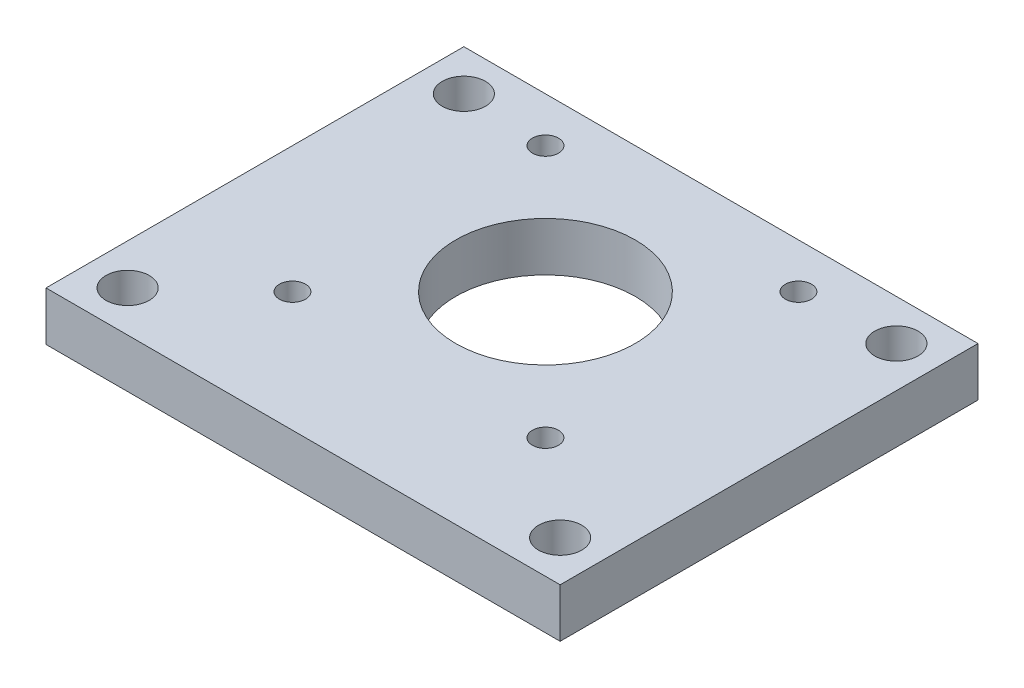
ISO-10303-21;
HEADER;
FILE_DESCRIPTION(('STEP AP214'),'2;1');
FILE_NAME('part.step','',(''),(''),'','','');
FILE_SCHEMA(('AUTOMOTIVE_DESIGN { 1 0 10303 214 1 1 1 1 }'));
ENDSEC;
DATA;
#1=APPLICATION_CONTEXT('core data for automotive mechanical design processes');
#2=APPLICATION_PROTOCOL_DEFINITION('international standard','automotive_design',2000,#1);
#3=PRODUCT_CONTEXT('',#1,'mechanical');
#4=PRODUCT('Part','Part','',(#3));
#5=PRODUCT_RELATED_PRODUCT_CATEGORY('part','',(#4));
#6=PRODUCT_DEFINITION_FORMATION('','',#4);
#7=PRODUCT_DEFINITION_CONTEXT('part definition',#1,'design');
#8=PRODUCT_DEFINITION('design','',#6,#7);
#9=PRODUCT_DEFINITION_SHAPE('','',#8);
#10=(LENGTH_UNIT() NAMED_UNIT(*) SI_UNIT(.MILLI.,.METRE.));
#11=(NAMED_UNIT(*) PLANE_ANGLE_UNIT() SI_UNIT($,.RADIAN.));
#12=(NAMED_UNIT(*) SI_UNIT($,.STERADIAN.) SOLID_ANGLE_UNIT());
#13=UNCERTAINTY_MEASURE_WITH_UNIT(LENGTH_MEASURE(1.E-05),#10,'distance_accuracy_value','');
#14=(GEOMETRIC_REPRESENTATION_CONTEXT(3) GLOBAL_UNCERTAINTY_ASSIGNED_CONTEXT((#13)) GLOBAL_UNIT_ASSIGNED_CONTEXT((#10,
#11,#12)) REPRESENTATION_CONTEXT('',''));
#15=CARTESIAN_POINT('',(0.,0.,0.));
#16=DIRECTION('',(0.,0.,1.));
#17=DIRECTION('',(1.,0.,0.));
#18=AXIS2_PLACEMENT_3D('',#15,#16,#17);
#19=CARTESIAN_POINT('',(0.,0.,0.));
#20=DIRECTION('',(0.,-1.,0.));
#21=DIRECTION('',(0.,0.,-1.));
#22=AXIS2_PLACEMENT_3D('',#19,#20,#21);
#23=PLANE('',#22);
#24=CARTESIAN_POINT('',(0.,0.,0.));
#25=DIRECTION('',(0.,1.,0.));
#26=DIRECTION('',(0.,0.,1.));
#27=AXIS2_PLACEMENT_3D('',#24,#25,#26);
#28=CIRCLE('',#27,11.);
#29=CARTESIAN_POINT('',(0.,0.,11.));
#30=VERTEX_POINT('',#29);
#31=EDGE_CURVE('E192',#30,#30,#28,.T.);
#32=ORIENTED_EDGE('',*,*,#31,.T.);
#33=EDGE_LOOP('',(#32));
#34=FACE_BOUND('',#33,.T.);
#35=CARTESIAN_POINT('',(-15.5,0.,-15.5));
#36=DIRECTION('',(0.,1.,0.));
#37=DIRECTION('',(0.,0.,1.));
#38=AXIS2_PLACEMENT_3D('',#35,#36,#37);
#39=CIRCLE('',#38,1.6);
#40=CARTESIAN_POINT('',(-15.5,0.,-13.9));
#41=VERTEX_POINT('',#40);
#42=EDGE_CURVE('E184',#41,#41,#39,.T.);
#43=ORIENTED_EDGE('',*,*,#42,.T.);
#44=EDGE_LOOP('',(#43));
#45=FACE_BOUND('',#44,.T.);
#46=DIRECTION('',(0.,0.,-1.));
#47=VECTOR('',#46,1.);
#48=CARTESIAN_POINT('',(32.,0.,-21.));
#49=LINE('',#48,#47);
#50=CARTESIAN_POINT('',(32.,0.,30.2));
#51=VERTEX_POINT('',#50);
#52=CARTESIAN_POINT('',(32.,0.,-21.));
#53=VERTEX_POINT('',#52);
#54=EDGE_CURVE('E108',#51,#53,#49,.T.);
#55=ORIENTED_EDGE('',*,*,#54,.F.);
#56=DIRECTION('',(1.,0.,0.));
#57=VECTOR('',#56,1.);
#58=CARTESIAN_POINT('',(32.,0.,30.2));
#59=LINE('',#58,#57);
#60=CARTESIAN_POINT('',(-31.,0.,30.2));
#61=VERTEX_POINT('',#60);
#62=EDGE_CURVE('E80',#61,#51,#59,.T.);
#63=ORIENTED_EDGE('',*,*,#62,.F.);
#64=DIRECTION('',(0.,0.,1.));
#65=VECTOR('',#64,1.);
#66=CARTESIAN_POINT('',(-31.,0.,30.2));
#67=LINE('',#66,#65);
#68=CARTESIAN_POINT('',(-31.,0.,-21.));
#69=VERTEX_POINT('',#68);
#70=EDGE_CURVE('E74',#69,#61,#67,.T.);
#71=ORIENTED_EDGE('',*,*,#70,.F.);
#72=DIRECTION('',(-1.,0.,0.));
#73=VECTOR('',#72,1.);
#74=CARTESIAN_POINT('',(-31.,0.,-21.));
#75=LINE('',#74,#73);
#76=EDGE_CURVE('E97',#53,#69,#75,.T.);
#77=ORIENTED_EDGE('',*,*,#76,.F.);
#78=EDGE_LOOP('',(#55,#63,#71,#77));
#79=FACE_BOUND('',#78,.T.);
#80=CARTESIAN_POINT('',(27.,0.,-16.));
#81=DIRECTION('',(0.,1.,0.));
#82=DIRECTION('',(0.,0.,1.));
#83=AXIS2_PLACEMENT_3D('',#80,#81,#82);
#84=CIRCLE('',#83,2.65);
#85=CARTESIAN_POINT('',(27.,0.,-13.35));
#86=VERTEX_POINT('',#85);
#87=EDGE_CURVE('E112',#86,#86,#84,.T.);
#88=ORIENTED_EDGE('',*,*,#87,.T.);
#89=EDGE_LOOP('',(#88));
#90=FACE_BOUND('',#89,.T.);
#91=CARTESIAN_POINT('',(27.,0.,25.2));
#92=DIRECTION('',(0.,1.,0.));
#93=DIRECTION('',(0.,0.,1.));
#94=AXIS2_PLACEMENT_3D('',#91,#92,#93);
#95=CIRCLE('',#94,2.65);
#96=CARTESIAN_POINT('',(27.,0.,27.85));
#97=VERTEX_POINT('',#96);
#98=EDGE_CURVE('E136',#97,#97,#95,.T.);
#99=ORIENTED_EDGE('',*,*,#98,.T.);
#100=EDGE_LOOP('',(#99));
#101=FACE_BOUND('',#100,.T.);
#102=CARTESIAN_POINT('',(-26.,0.,25.2));
#103=DIRECTION('',(0.,1.,0.));
#104=DIRECTION('',(0.,0.,1.));
#105=AXIS2_PLACEMENT_3D('',#102,#103,#104);
#106=CIRCLE('',#105,2.65);
#107=CARTESIAN_POINT('',(-26.,0.,27.85));
#108=VERTEX_POINT('',#107);
#109=EDGE_CURVE('E144',#108,#108,#106,.T.);
#110=ORIENTED_EDGE('',*,*,#109,.T.);
#111=EDGE_LOOP('',(#110));
#112=FACE_BOUND('',#111,.T.);
#113=CARTESIAN_POINT('',(-26.,0.,-16.));
#114=DIRECTION('',(0.,1.,0.));
#115=DIRECTION('',(0.,0.,1.));
#116=AXIS2_PLACEMENT_3D('',#113,#114,#115);
#117=CIRCLE('',#116,2.65);
#118=CARTESIAN_POINT('',(-26.,0.,-13.35));
#119=VERTEX_POINT('',#118);
#120=EDGE_CURVE('E152',#119,#119,#117,.T.);
#121=ORIENTED_EDGE('',*,*,#120,.T.);
#122=EDGE_LOOP('',(#121));
#123=FACE_BOUND('',#122,.T.);
#124=CARTESIAN_POINT('',(-15.5,0.,15.5));
#125=DIRECTION('',(0.,1.,0.));
#126=DIRECTION('',(0.,0.,1.));
#127=AXIS2_PLACEMENT_3D('',#124,#125,#126);
#128=CIRCLE('',#127,1.6);
#129=CARTESIAN_POINT('',(-15.5,0.,17.1));
#130=VERTEX_POINT('',#129);
#131=EDGE_CURVE('E160',#130,#130,#128,.T.);
#132=ORIENTED_EDGE('',*,*,#131,.T.);
#133=EDGE_LOOP('',(#132));
#134=FACE_BOUND('',#133,.T.);
#135=CARTESIAN_POINT('',(15.5,0.,15.5));
#136=DIRECTION('',(0.,1.,0.));
#137=DIRECTION('',(0.,0.,1.));
#138=AXIS2_PLACEMENT_3D('',#135,#136,#137);
#139=CIRCLE('',#138,1.6);
#140=CARTESIAN_POINT('',(15.5,0.,17.1));
#141=VERTEX_POINT('',#140);
#142=EDGE_CURVE('E168',#141,#141,#139,.T.);
#143=ORIENTED_EDGE('',*,*,#142,.T.);
#144=EDGE_LOOP('',(#143));
#145=FACE_BOUND('',#144,.T.);
#146=CARTESIAN_POINT('',(15.5,0.,-15.5));
#147=DIRECTION('',(0.,1.,0.));
#148=DIRECTION('',(0.,0.,1.));
#149=AXIS2_PLACEMENT_3D('',#146,#147,#148);
#150=CIRCLE('',#149,1.6);
#151=CARTESIAN_POINT('',(15.5,0.,-13.9));
#152=VERTEX_POINT('',#151);
#153=EDGE_CURVE('E176',#152,#152,#150,.T.);
#154=ORIENTED_EDGE('',*,*,#153,.T.);
#155=EDGE_LOOP('',(#154));
#156=FACE_BOUND('',#155,.T.);
#157=ADVANCED_FACE('F39',(#34,#45,#79,#90,#101,#112,#123,#134,#145,#156),#23,.T.);
#158=CARTESIAN_POINT('',(32.,6.,-21.));
#159=DIRECTION('',(-1.,0.,0.));
#160=DIRECTION('',(0.,0.,1.));
#161=AXIS2_PLACEMENT_3D('',#158,#159,#160);
#162=PLANE('',#161);
#163=ORIENTED_EDGE('',*,*,#54,.T.);
#164=DIRECTION('',(0.,-1.,0.));
#165=VECTOR('',#164,1.);
#166=CARTESIAN_POINT('',(32.,6.,-21.));
#167=LINE('',#166,#165);
#168=CARTESIAN_POINT('',(32.,6.,-21.));
#169=VERTEX_POINT('',#168);
#170=EDGE_CURVE('E11',#169,#53,#167,.T.);
#171=ORIENTED_EDGE('',*,*,#170,.F.);
#172=DIRECTION('',(0.,0.,-1.));
#173=VECTOR('',#172,1.);
#174=CARTESIAN_POINT('',(32.,6.,-21.));
#175=LINE('',#174,#173);
#176=CARTESIAN_POINT('',(32.,6.,30.2));
#177=VERTEX_POINT('',#176);
#178=EDGE_CURVE('E92',#177,#169,#175,.T.);
#179=ORIENTED_EDGE('',*,*,#178,.F.);
#180=DIRECTION('',(0.,-1.,0.));
#181=VECTOR('',#180,1.);
#182=CARTESIAN_POINT('',(32.,6.,30.2));
#183=LINE('',#182,#181);
#184=EDGE_CURVE('E104',#177,#51,#183,.T.);
#185=ORIENTED_EDGE('',*,*,#184,.T.);
#186=EDGE_LOOP('',(#163,#171,#179,#185));
#187=FACE_BOUND('',#186,.T.);
#188=ADVANCED_FACE('F41',(#187),#162,.F.);
#189=CARTESIAN_POINT('',(-31.,6.,-21.));
#190=DIRECTION('',(0.,0.,1.));
#191=DIRECTION('',(1.,0.,0.));
#192=AXIS2_PLACEMENT_3D('',#189,#190,#191);
#193=PLANE('',#192);
#194=ORIENTED_EDGE('',*,*,#76,.T.);
#195=DIRECTION('',(0.,-1.,0.));
#196=VECTOR('',#195,1.);
#197=CARTESIAN_POINT('',(-31.,6.,-21.));
#198=LINE('',#197,#196);
#199=CARTESIAN_POINT('',(-31.,6.,-21.));
#200=VERTEX_POINT('',#199);
#201=EDGE_CURVE('E49',#200,#69,#198,.T.);
#202=ORIENTED_EDGE('',*,*,#201,.F.);
#203=DIRECTION('',(-1.,0.,0.));
#204=VECTOR('',#203,1.);
#205=CARTESIAN_POINT('',(-31.,6.,-21.));
#206=LINE('',#205,#204);
#207=EDGE_CURVE('E87',#169,#200,#206,.T.);
#208=ORIENTED_EDGE('',*,*,#207,.F.);
#209=ORIENTED_EDGE('',*,*,#170,.T.);
#210=EDGE_LOOP('',(#194,#202,#208,#209));
#211=FACE_BOUND('',#210,.T.);
#212=ADVANCED_FACE('F96',(#211),#193,.F.);
#213=CARTESIAN_POINT('',(-31.,6.,30.2));
#214=DIRECTION('',(1.,0.,0.));
#215=DIRECTION('',(0.,0.,-1.));
#216=AXIS2_PLACEMENT_3D('',#213,#214,#215);
#217=PLANE('',#216);
#218=ORIENTED_EDGE('',*,*,#70,.T.);
#219=DIRECTION('',(0.,-1.,0.));
#220=VECTOR('',#219,1.);
#221=CARTESIAN_POINT('',(-31.,6.,30.2));
#222=LINE('',#221,#220);
#223=CARTESIAN_POINT('',(-31.,6.,30.2));
#224=VERTEX_POINT('',#223);
#225=EDGE_CURVE('E99',#224,#61,#222,.T.);
#226=ORIENTED_EDGE('',*,*,#225,.F.);
#227=DIRECTION('',(0.,0.,1.));
#228=VECTOR('',#227,1.);
#229=CARTESIAN_POINT('',(-31.,6.,30.2));
#230=LINE('',#229,#228);
#231=EDGE_CURVE('E90',#200,#224,#230,.T.);
#232=ORIENTED_EDGE('',*,*,#231,.F.);
#233=ORIENTED_EDGE('',*,*,#201,.T.);
#234=EDGE_LOOP('',(#218,#226,#232,#233));
#235=FACE_BOUND('',#234,.T.);
#236=ADVANCED_FACE('F100',(#235),#217,.F.);
#237=CARTESIAN_POINT('',(32.,6.,30.2));
#238=DIRECTION('',(0.,0.,-1.));
#239=DIRECTION('',(-1.,0.,0.));
#240=AXIS2_PLACEMENT_3D('',#237,#238,#239);
#241=PLANE('',#240);
#242=ORIENTED_EDGE('',*,*,#62,.T.);
#243=ORIENTED_EDGE('',*,*,#184,.F.);
#244=DIRECTION('',(1.,0.,0.));
#245=VECTOR('',#244,1.);
#246=CARTESIAN_POINT('',(32.,6.,30.2));
#247=LINE('',#246,#245);
#248=EDGE_CURVE('E57',#224,#177,#247,.T.);
#249=ORIENTED_EDGE('',*,*,#248,.F.);
#250=ORIENTED_EDGE('',*,*,#225,.T.);
#251=EDGE_LOOP('',(#242,#243,#249,#250));
#252=FACE_BOUND('',#251,.T.);
#253=ADVANCED_FACE('F122',(#252),#241,.F.);
#254=CARTESIAN_POINT('',(0.,6.,0.));
#255=DIRECTION('',(0.,-1.,0.));
#256=DIRECTION('',(0.,0.,-1.));
#257=AXIS2_PLACEMENT_3D('',#254,#255,#256);
#258=PLANE('',#257);
#259=CARTESIAN_POINT('',(0.,6.,0.));
#260=DIRECTION('',(0.,1.,0.));
#261=DIRECTION('',(0.,0.,1.));
#262=AXIS2_PLACEMENT_3D('',#259,#260,#261);
#263=CIRCLE('',#262,11.);
#264=CARTESIAN_POINT('',(0.,6.,11.));
#265=VERTEX_POINT('',#264);
#266=EDGE_CURVE('E196',#265,#265,#263,.T.);
#267=ORIENTED_EDGE('',*,*,#266,.F.);
#268=EDGE_LOOP('',(#267));
#269=FACE_BOUND('',#268,.T.);
#270=CARTESIAN_POINT('',(-15.5,6.,-15.5));
#271=DIRECTION('',(0.,1.,0.));
#272=DIRECTION('',(0.,0.,1.));
#273=AXIS2_PLACEMENT_3D('',#270,#271,#272);
#274=CIRCLE('',#273,1.6);
#275=CARTESIAN_POINT('',(-15.5,6.,-13.9));
#276=VERTEX_POINT('',#275);
#277=EDGE_CURVE('E188',#276,#276,#274,.T.);
#278=ORIENTED_EDGE('',*,*,#277,.F.);
#279=EDGE_LOOP('',(#278));
#280=FACE_BOUND('',#279,.T.);
#281=CARTESIAN_POINT('',(15.5,6.,-15.5));
#282=DIRECTION('',(0.,1.,0.));
#283=DIRECTION('',(0.,0.,1.));
#284=AXIS2_PLACEMENT_3D('',#281,#282,#283);
#285=CIRCLE('',#284,1.6);
#286=CARTESIAN_POINT('',(15.5,6.,-13.9));
#287=VERTEX_POINT('',#286);
#288=EDGE_CURVE('E180',#287,#287,#285,.T.);
#289=ORIENTED_EDGE('',*,*,#288,.F.);
#290=EDGE_LOOP('',(#289));
#291=FACE_BOUND('',#290,.T.);
#292=CARTESIAN_POINT('',(15.5,6.,15.5));
#293=DIRECTION('',(0.,1.,0.));
#294=DIRECTION('',(0.,0.,1.));
#295=AXIS2_PLACEMENT_3D('',#292,#293,#294);
#296=CIRCLE('',#295,1.6);
#297=CARTESIAN_POINT('',(15.5,6.,17.1));
#298=VERTEX_POINT('',#297);
#299=EDGE_CURVE('E172',#298,#298,#296,.T.);
#300=ORIENTED_EDGE('',*,*,#299,.F.);
#301=EDGE_LOOP('',(#300));
#302=FACE_BOUND('',#301,.T.);
#303=CARTESIAN_POINT('',(-15.5,6.,15.5));
#304=DIRECTION('',(0.,1.,0.));
#305=DIRECTION('',(0.,0.,1.));
#306=AXIS2_PLACEMENT_3D('',#303,#304,#305);
#307=CIRCLE('',#306,1.6);
#308=CARTESIAN_POINT('',(-15.5,6.,17.1));
#309=VERTEX_POINT('',#308);
#310=EDGE_CURVE('E164',#309,#309,#307,.T.);
#311=ORIENTED_EDGE('',*,*,#310,.F.);
#312=EDGE_LOOP('',(#311));
#313=FACE_BOUND('',#312,.T.);
#314=CARTESIAN_POINT('',(-26.,6.,-16.));
#315=DIRECTION('',(0.,1.,0.));
#316=DIRECTION('',(0.,0.,1.));
#317=AXIS2_PLACEMENT_3D('',#314,#315,#316);
#318=CIRCLE('',#317,2.65);
#319=CARTESIAN_POINT('',(-26.,6.,-13.35));
#320=VERTEX_POINT('',#319);
#321=EDGE_CURVE('E156',#320,#320,#318,.T.);
#322=ORIENTED_EDGE('',*,*,#321,.F.);
#323=EDGE_LOOP('',(#322));
#324=FACE_BOUND('',#323,.T.);
#325=CARTESIAN_POINT('',(-26.,6.,25.2));
#326=DIRECTION('',(0.,1.,0.));
#327=DIRECTION('',(0.,0.,1.));
#328=AXIS2_PLACEMENT_3D('',#325,#326,#327);
#329=CIRCLE('',#328,2.65);
#330=CARTESIAN_POINT('',(-26.,6.,27.85));
#331=VERTEX_POINT('',#330);
#332=EDGE_CURVE('E148',#331,#331,#329,.T.);
#333=ORIENTED_EDGE('',*,*,#332,.F.);
#334=EDGE_LOOP('',(#333));
#335=FACE_BOUND('',#334,.T.);
#336=CARTESIAN_POINT('',(27.,6.,25.2));
#337=DIRECTION('',(0.,1.,0.));
#338=DIRECTION('',(0.,0.,1.));
#339=AXIS2_PLACEMENT_3D('',#336,#337,#338);
#340=CIRCLE('',#339,2.65);
#341=CARTESIAN_POINT('',(27.,6.,27.85));
#342=VERTEX_POINT('',#341);
#343=EDGE_CURVE('E140',#342,#342,#340,.T.);
#344=ORIENTED_EDGE('',*,*,#343,.F.);
#345=EDGE_LOOP('',(#344));
#346=FACE_BOUND('',#345,.T.);
#347=CARTESIAN_POINT('',(27.,6.,-16.));
#348=DIRECTION('',(0.,1.,0.));
#349=DIRECTION('',(0.,0.,1.));
#350=AXIS2_PLACEMENT_3D('',#347,#348,#349);
#351=CIRCLE('',#350,2.65);
#352=CARTESIAN_POINT('',(27.,6.,-13.35));
#353=VERTEX_POINT('',#352);
#354=EDGE_CURVE('E132',#353,#353,#351,.T.);
#355=ORIENTED_EDGE('',*,*,#354,.F.);
#356=EDGE_LOOP('',(#355));
#357=FACE_BOUND('',#356,.T.);
#358=ORIENTED_EDGE('',*,*,#178,.T.);
#359=ORIENTED_EDGE('',*,*,#207,.T.);
#360=ORIENTED_EDGE('',*,*,#231,.T.);
#361=ORIENTED_EDGE('',*,*,#248,.T.);
#362=EDGE_LOOP('',(#358,#359,#360,#361));
#363=FACE_BOUND('',#362,.T.);
#364=ADVANCED_FACE('F88',(#269,#280,#291,#302,#313,#324,#335,#346,#357,#363),#258,.F.);
#365=CARTESIAN_POINT('',(27.,6.,-16.));
#366=DIRECTION('',(0.,1.,0.));
#367=DIRECTION('',(0.,0.,1.));
#368=AXIS2_PLACEMENT_3D('',#365,#366,#367);
#369=CYLINDRICAL_SURFACE('',#368,2.65);
#370=ORIENTED_EDGE('',*,*,#87,.F.);
#371=EDGE_LOOP('',(#370));
#372=FACE_BOUND('',#371,.T.);
#373=ORIENTED_EDGE('',*,*,#354,.T.);
#374=EDGE_LOOP('',(#373));
#375=FACE_BOUND('',#374,.T.);
#376=ADVANCED_FACE('F205',(#372,#375),#369,.F.);
#377=CARTESIAN_POINT('',(27.,6.,25.2));
#378=DIRECTION('',(0.,1.,0.));
#379=DIRECTION('',(0.,0.,1.));
#380=AXIS2_PLACEMENT_3D('',#377,#378,#379);
#381=CYLINDRICAL_SURFACE('',#380,2.65);
#382=ORIENTED_EDGE('',*,*,#98,.F.);
#383=EDGE_LOOP('',(#382));
#384=FACE_BOUND('',#383,.T.);
#385=ORIENTED_EDGE('',*,*,#343,.T.);
#386=EDGE_LOOP('',(#385));
#387=FACE_BOUND('',#386,.T.);
#388=ADVANCED_FACE('F224',(#384,#387),#381,.F.);
#389=CARTESIAN_POINT('',(-26.,6.,25.2));
#390=DIRECTION('',(0.,1.,0.));
#391=DIRECTION('',(0.,0.,1.));
#392=AXIS2_PLACEMENT_3D('',#389,#390,#391);
#393=CYLINDRICAL_SURFACE('',#392,2.65);
#394=ORIENTED_EDGE('',*,*,#109,.F.);
#395=EDGE_LOOP('',(#394));
#396=FACE_BOUND('',#395,.T.);
#397=ORIENTED_EDGE('',*,*,#332,.T.);
#398=EDGE_LOOP('',(#397));
#399=FACE_BOUND('',#398,.T.);
#400=ADVANCED_FACE('F230',(#396,#399),#393,.F.);
#401=CARTESIAN_POINT('',(-26.,6.,-16.));
#402=DIRECTION('',(0.,1.,0.));
#403=DIRECTION('',(0.,0.,1.));
#404=AXIS2_PLACEMENT_3D('',#401,#402,#403);
#405=CYLINDRICAL_SURFACE('',#404,2.65);
#406=ORIENTED_EDGE('',*,*,#120,.F.);
#407=EDGE_LOOP('',(#406));
#408=FACE_BOUND('',#407,.T.);
#409=ORIENTED_EDGE('',*,*,#321,.T.);
#410=EDGE_LOOP('',(#409));
#411=FACE_BOUND('',#410,.T.);
#412=ADVANCED_FACE('F307',(#408,#411),#405,.F.);
#413=CARTESIAN_POINT('',(-15.5,6.,15.5));
#414=DIRECTION('',(0.,1.,0.));
#415=DIRECTION('',(0.,0.,1.));
#416=AXIS2_PLACEMENT_3D('',#413,#414,#415);
#417=CYLINDRICAL_SURFACE('',#416,1.6);
#418=ORIENTED_EDGE('',*,*,#131,.F.);
#419=EDGE_LOOP('',(#418));
#420=FACE_BOUND('',#419,.T.);
#421=ORIENTED_EDGE('',*,*,#310,.T.);
#422=EDGE_LOOP('',(#421));
#423=FACE_BOUND('',#422,.T.);
#424=ADVANCED_FACE('F299',(#420,#423),#417,.F.);
#425=CARTESIAN_POINT('',(15.5,6.,15.5));
#426=DIRECTION('',(0.,1.,0.));
#427=DIRECTION('',(0.,0.,1.));
#428=AXIS2_PLACEMENT_3D('',#425,#426,#427);
#429=CYLINDRICAL_SURFACE('',#428,1.6);
#430=ORIENTED_EDGE('',*,*,#142,.F.);
#431=EDGE_LOOP('',(#430));
#432=FACE_BOUND('',#431,.T.);
#433=ORIENTED_EDGE('',*,*,#299,.T.);
#434=EDGE_LOOP('',(#433));
#435=FACE_BOUND('',#434,.T.);
#436=ADVANCED_FACE('F291',(#432,#435),#429,.F.);
#437=CARTESIAN_POINT('',(15.5,6.,-15.5));
#438=DIRECTION('',(0.,1.,0.));
#439=DIRECTION('',(0.,0.,1.));
#440=AXIS2_PLACEMENT_3D('',#437,#438,#439);
#441=CYLINDRICAL_SURFACE('',#440,1.6);
#442=ORIENTED_EDGE('',*,*,#153,.F.);
#443=EDGE_LOOP('',(#442));
#444=FACE_BOUND('',#443,.T.);
#445=ORIENTED_EDGE('',*,*,#288,.T.);
#446=EDGE_LOOP('',(#445));
#447=FACE_BOUND('',#446,.T.);
#448=ADVANCED_FACE('F284',(#444,#447),#441,.F.);
#449=CARTESIAN_POINT('',(-15.5,6.,-15.5));
#450=DIRECTION('',(0.,1.,0.));
#451=DIRECTION('',(0.,0.,1.));
#452=AXIS2_PLACEMENT_3D('',#449,#450,#451);
#453=CYLINDRICAL_SURFACE('',#452,1.6);
#454=ORIENTED_EDGE('',*,*,#42,.F.);
#455=EDGE_LOOP('',(#454));
#456=FACE_BOUND('',#455,.T.);
#457=ORIENTED_EDGE('',*,*,#277,.T.);
#458=EDGE_LOOP('',(#457));
#459=FACE_BOUND('',#458,.T.);
#460=ADVANCED_FACE('F274',(#456,#459),#453,.F.);
#461=CARTESIAN_POINT('',(0.,6.,0.));
#462=DIRECTION('',(0.,1.,0.));
#463=DIRECTION('',(0.,0.,1.));
#464=AXIS2_PLACEMENT_3D('',#461,#462,#463);
#465=CYLINDRICAL_SURFACE('',#464,11.);
#466=ORIENTED_EDGE('',*,*,#31,.F.);
#467=EDGE_LOOP('',(#466));
#468=FACE_BOUND('',#467,.T.);
#469=ORIENTED_EDGE('',*,*,#266,.T.);
#470=EDGE_LOOP('',(#469));
#471=FACE_BOUND('',#470,.T.);
#472=ADVANCED_FACE('F201',(#468,#471),#465,.F.);
#473=CLOSED_SHELL('',(#157,#188,#212,#236,#253,#364,#376,#388,#400,#412,#424,#436,#448,#460,#472));
#474=MANIFOLD_SOLID_BREP('B2',#473);
#475=ADVANCED_BREP_SHAPE_REPRESENTATION('',(#18,#474),#14);
#476=SHAPE_DEFINITION_REPRESENTATION(#9,#475);
ENDSEC;
END-ISO-10303-21;
